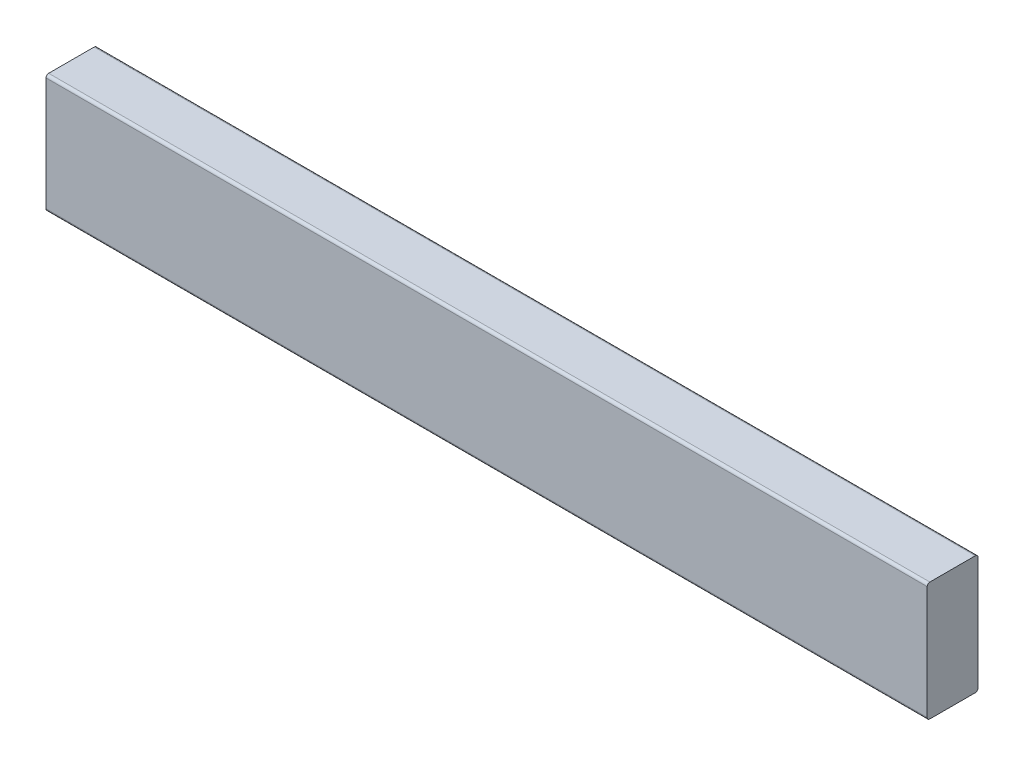
ISO-10303-21;
HEADER;
FILE_DESCRIPTION(('STEP AP214'),'2;1');
FILE_NAME('part.step','',(''),(''),'','','');
FILE_SCHEMA(('AUTOMOTIVE_DESIGN { 1 0 10303 214 1 1 1 1 }'));
ENDSEC;
DATA;
#1=APPLICATION_CONTEXT('core data for automotive mechanical design processes');
#2=APPLICATION_PROTOCOL_DEFINITION('international standard','automotive_design',2000,#1);
#3=PRODUCT_CONTEXT('',#1,'mechanical');
#4=PRODUCT('Part','Part','',(#3));
#5=PRODUCT_RELATED_PRODUCT_CATEGORY('part','',(#4));
#6=PRODUCT_DEFINITION_FORMATION('','',#4);
#7=PRODUCT_DEFINITION_CONTEXT('part definition',#1,'design');
#8=PRODUCT_DEFINITION('design','',#6,#7);
#9=PRODUCT_DEFINITION_SHAPE('','',#8);
#10=(LENGTH_UNIT() NAMED_UNIT(*) SI_UNIT(.MILLI.,.METRE.));
#11=(NAMED_UNIT(*) PLANE_ANGLE_UNIT() SI_UNIT($,.RADIAN.));
#12=(NAMED_UNIT(*) SI_UNIT($,.STERADIAN.) SOLID_ANGLE_UNIT());
#13=UNCERTAINTY_MEASURE_WITH_UNIT(LENGTH_MEASURE(1.E-05),#10,'distance_accuracy_value','');
#14=(GEOMETRIC_REPRESENTATION_CONTEXT(3) GLOBAL_UNCERTAINTY_ASSIGNED_CONTEXT((#13)) GLOBAL_UNIT_ASSIGNED_CONTEXT((#10,
#11,#12)) REPRESENTATION_CONTEXT('',''));
#15=CARTESIAN_POINT('',(0.,0.,0.));
#16=DIRECTION('',(0.,0.,1.));
#17=DIRECTION('',(1.,0.,0.));
#18=AXIS2_PLACEMENT_3D('',#15,#16,#17);
#19=CARTESIAN_POINT('',(660.4,-44.45,19.05));
#20=DIRECTION('',(0.,1.,0.));
#21=DIRECTION('',(0.,0.,1.));
#22=AXIS2_PLACEMENT_3D('',#19,#20,#21);
#23=PLANE('',#22);
#24=DIRECTION('',(0.,0.,-1.));
#25=VECTOR('',#24,1.);
#26=CARTESIAN_POINT('',(0.,-44.45,19.05));
#27=LINE('',#26,#25);
#28=CARTESIAN_POINT('',(0.,-44.45,17.05));
#29=VERTEX_POINT('',#28);
#30=CARTESIAN_POINT('',(0.,-44.45,-17.05));
#31=VERTEX_POINT('',#30);
#32=EDGE_CURVE('E127',#29,#31,#27,.T.);
#33=ORIENTED_EDGE('',*,*,#32,.T.);
#34=DIRECTION('',(-1.,0.,0.));
#35=VECTOR('',#34,1.);
#36=CARTESIAN_POINT('',(660.4,-44.45,-17.05));
#37=LINE('',#36,#35);
#38=CARTESIAN_POINT('',(660.4,-44.45,-17.05));
#39=VERTEX_POINT('',#38);
#40=EDGE_CURVE('E150',#31,#39,#37,.F.);
#41=ORIENTED_EDGE('',*,*,#40,.T.);
#42=DIRECTION('',(0.,0.,-1.));
#43=VECTOR('',#42,1.);
#44=CARTESIAN_POINT('',(660.4,-44.45,19.05));
#45=LINE('',#44,#43);
#46=CARTESIAN_POINT('',(660.4,-44.45,17.05));
#47=VERTEX_POINT('',#46);
#48=EDGE_CURVE('E125',#47,#39,#45,.T.);
#49=ORIENTED_EDGE('',*,*,#48,.F.);
#50=DIRECTION('',(-1.,0.,0.));
#51=VECTOR('',#50,1.);
#52=CARTESIAN_POINT('',(660.4,-44.45,17.05));
#53=LINE('',#52,#51);
#54=EDGE_CURVE('E147',#47,#29,#53,.T.);
#55=ORIENTED_EDGE('',*,*,#54,.T.);
#56=EDGE_LOOP('',(#33,#41,#49,#55));
#57=FACE_BOUND('',#56,.T.);
#58=ADVANCED_FACE('F32',(#57),#23,.F.);
#59=CARTESIAN_POINT('',(660.4,44.45,-19.05));
#60=DIRECTION('',(0.,0.,1.));
#61=DIRECTION('',(1.,0.,0.));
#62=AXIS2_PLACEMENT_3D('',#59,#60,#61);
#63=PLANE('',#62);
#64=DIRECTION('',(0.,1.,0.));
#65=VECTOR('',#64,1.);
#66=CARTESIAN_POINT('',(0.,44.45,-19.05));
#67=LINE('',#66,#65);
#68=CARTESIAN_POINT('',(0.,-42.45,-19.05));
#69=VERTEX_POINT('',#68);
#70=CARTESIAN_POINT('',(0.,42.45,-19.05));
#71=VERTEX_POINT('',#70);
#72=EDGE_CURVE('E123',#69,#71,#67,.T.);
#73=ORIENTED_EDGE('',*,*,#72,.T.);
#74=DIRECTION('',(-1.,0.,0.));
#75=VECTOR('',#74,1.);
#76=CARTESIAN_POINT('',(660.4,42.45,-19.05));
#77=LINE('',#76,#75);
#78=CARTESIAN_POINT('',(660.4,42.45,-19.05));
#79=VERTEX_POINT('',#78);
#80=EDGE_CURVE('E102',#71,#79,#77,.F.);
#81=ORIENTED_EDGE('',*,*,#80,.T.);
#82=DIRECTION('',(0.,1.,0.));
#83=VECTOR('',#82,1.);
#84=CARTESIAN_POINT('',(660.4,44.45,-19.05));
#85=LINE('',#84,#83);
#86=CARTESIAN_POINT('',(660.4,-42.45,-19.05));
#87=VERTEX_POINT('',#86);
#88=EDGE_CURVE('E166',#87,#79,#85,.T.);
#89=ORIENTED_EDGE('',*,*,#88,.F.);
#90=DIRECTION('',(-1.,0.,0.));
#91=VECTOR('',#90,1.);
#92=CARTESIAN_POINT('',(660.4,-42.45,-19.05));
#93=LINE('',#92,#91);
#94=EDGE_CURVE('E107',#87,#69,#93,.T.);
#95=ORIENTED_EDGE('',*,*,#94,.T.);
#96=EDGE_LOOP('',(#73,#81,#89,#95));
#97=FACE_BOUND('',#96,.T.);
#98=ADVANCED_FACE('F183',(#97),#63,.F.);
#99=CARTESIAN_POINT('',(660.4,44.45,19.05));
#100=DIRECTION('',(0.,-1.,0.));
#101=DIRECTION('',(0.,0.,-1.));
#102=AXIS2_PLACEMENT_3D('',#99,#100,#101);
#103=PLANE('',#102);
#104=DIRECTION('',(0.,0.,1.));
#105=VECTOR('',#104,1.);
#106=CARTESIAN_POINT('',(660.4,44.45,19.05));
#107=LINE('',#106,#105);
#108=CARTESIAN_POINT('',(660.4,44.45,-17.05));
#109=VERTEX_POINT('',#108);
#110=CARTESIAN_POINT('',(660.4,44.45,17.05));
#111=VERTEX_POINT('',#110);
#112=EDGE_CURVE('E116',#109,#111,#107,.T.);
#113=ORIENTED_EDGE('',*,*,#112,.F.);
#114=DIRECTION('',(-1.,0.,0.));
#115=VECTOR('',#114,1.);
#116=CARTESIAN_POINT('',(660.4,44.45,-17.05));
#117=LINE('',#116,#115);
#118=CARTESIAN_POINT('',(0.,44.45,-17.05));
#119=VERTEX_POINT('',#118);
#120=EDGE_CURVE('E101',#109,#119,#117,.T.);
#121=ORIENTED_EDGE('',*,*,#120,.T.);
#122=DIRECTION('',(0.,0.,1.));
#123=VECTOR('',#122,1.);
#124=CARTESIAN_POINT('',(0.,44.45,19.05));
#125=LINE('',#124,#123);
#126=CARTESIAN_POINT('',(0.,44.45,17.05));
#127=VERTEX_POINT('',#126);
#128=EDGE_CURVE('E114',#119,#127,#125,.T.);
#129=ORIENTED_EDGE('',*,*,#128,.T.);
#130=DIRECTION('',(-1.,0.,0.));
#131=VECTOR('',#130,1.);
#132=CARTESIAN_POINT('',(660.4,44.45,17.05));
#133=LINE('',#132,#131);
#134=EDGE_CURVE('E118',#127,#111,#133,.F.);
#135=ORIENTED_EDGE('',*,*,#134,.T.);
#136=EDGE_LOOP('',(#113,#121,#129,#135));
#137=FACE_BOUND('',#136,.T.);
#138=ADVANCED_FACE('F113',(#137),#103,.F.);
#139=CARTESIAN_POINT('',(660.4,44.45,19.05));
#140=DIRECTION('',(0.,0.,-1.));
#141=DIRECTION('',(-1.,0.,0.));
#142=AXIS2_PLACEMENT_3D('',#139,#140,#141);
#143=PLANE('',#142);
#144=DIRECTION('',(0.,-1.,0.));
#145=VECTOR('',#144,1.);
#146=CARTESIAN_POINT('',(0.,44.45,19.05));
#147=LINE('',#146,#145);
#148=CARTESIAN_POINT('',(0.,42.45,19.05));
#149=VERTEX_POINT('',#148);
#150=CARTESIAN_POINT('',(0.,-42.45,19.05));
#151=VERTEX_POINT('',#150);
#152=EDGE_CURVE('E122',#149,#151,#147,.T.);
#153=ORIENTED_EDGE('',*,*,#152,.T.);
#154=DIRECTION('',(-1.,0.,0.));
#155=VECTOR('',#154,1.);
#156=CARTESIAN_POINT('',(660.4,-42.45,19.05));
#157=LINE('',#156,#155);
#158=CARTESIAN_POINT('',(660.4,-42.45,19.05));
#159=VERTEX_POINT('',#158);
#160=EDGE_CURVE('E11',#151,#159,#157,.F.);
#161=ORIENTED_EDGE('',*,*,#160,.T.);
#162=DIRECTION('',(0.,-1.,0.));
#163=VECTOR('',#162,1.);
#164=CARTESIAN_POINT('',(660.4,44.45,19.05));
#165=LINE('',#164,#163);
#166=CARTESIAN_POINT('',(660.4,42.45,19.05));
#167=VERTEX_POINT('',#166);
#168=EDGE_CURVE('E131',#167,#159,#165,.T.);
#169=ORIENTED_EDGE('',*,*,#168,.F.);
#170=DIRECTION('',(-1.,0.,0.));
#171=VECTOR('',#170,1.);
#172=CARTESIAN_POINT('',(660.4,42.45,19.05));
#173=LINE('',#172,#171);
#174=EDGE_CURVE('E40',#167,#149,#173,.T.);
#175=ORIENTED_EDGE('',*,*,#174,.T.);
#176=EDGE_LOOP('',(#153,#161,#169,#175));
#177=FACE_BOUND('',#176,.T.);
#178=ADVANCED_FACE('F153',(#177),#143,.F.);
#179=CARTESIAN_POINT('',(660.4,0.,0.));
#180=DIRECTION('',(-1.,0.,0.));
#181=DIRECTION('',(0.,0.,1.));
#182=AXIS2_PLACEMENT_3D('',#179,#180,#181);
#183=PLANE('',#182);
#184=ORIENTED_EDGE('',*,*,#88,.T.);
#185=CARTESIAN_POINT('',(660.4,42.45,-17.05));
#186=DIRECTION('',(-1.,0.,0.));
#187=DIRECTION('',(0.,0.,1.));
#188=AXIS2_PLACEMENT_3D('',#185,#186,#187);
#189=CIRCLE('',#188,2.);
#190=EDGE_CURVE('E145',#79,#109,#189,.F.);
#191=ORIENTED_EDGE('',*,*,#190,.T.);
#192=ORIENTED_EDGE('',*,*,#112,.T.);
#193=CARTESIAN_POINT('',(660.4,42.45,17.05));
#194=DIRECTION('',(-1.,0.,0.));
#195=DIRECTION('',(0.,0.,1.));
#196=AXIS2_PLACEMENT_3D('',#193,#194,#195);
#197=CIRCLE('',#196,2.);
#198=EDGE_CURVE('E52',#111,#167,#197,.F.);
#199=ORIENTED_EDGE('',*,*,#198,.T.);
#200=ORIENTED_EDGE('',*,*,#168,.T.);
#201=CARTESIAN_POINT('',(660.4,-42.45,17.05));
#202=DIRECTION('',(-1.,0.,0.));
#203=DIRECTION('',(0.,0.,1.));
#204=AXIS2_PLACEMENT_3D('',#201,#202,#203);
#205=CIRCLE('',#204,2.);
#206=EDGE_CURVE('E141',#159,#47,#205,.F.);
#207=ORIENTED_EDGE('',*,*,#206,.T.);
#208=ORIENTED_EDGE('',*,*,#48,.T.);
#209=CARTESIAN_POINT('',(660.4,-42.45,-17.05));
#210=DIRECTION('',(-1.,0.,0.));
#211=DIRECTION('',(0.,0.,1.));
#212=AXIS2_PLACEMENT_3D('',#209,#210,#211);
#213=CIRCLE('',#212,2.);
#214=EDGE_CURVE('E143',#39,#87,#213,.F.);
#215=ORIENTED_EDGE('',*,*,#214,.T.);
#216=EDGE_LOOP('',(#184,#191,#192,#199,#200,#207,#208,#215));
#217=FACE_BOUND('',#216,.T.);
#218=ADVANCED_FACE('F172',(#217),#183,.F.);
#219=CARTESIAN_POINT('',(0.,0.,0.));
#220=DIRECTION('',(-1.,0.,0.));
#221=DIRECTION('',(0.,0.,1.));
#222=AXIS2_PLACEMENT_3D('',#219,#220,#221);
#223=PLANE('',#222);
#224=ORIENTED_EDGE('',*,*,#128,.F.);
#225=CARTESIAN_POINT('',(0.,42.45,-17.05));
#226=DIRECTION('',(-1.,0.,0.));
#227=DIRECTION('',(0.,0.,1.));
#228=AXIS2_PLACEMENT_3D('',#225,#226,#227);
#229=CIRCLE('',#228,2.);
#230=EDGE_CURVE('E97',#119,#71,#229,.T.);
#231=ORIENTED_EDGE('',*,*,#230,.T.);
#232=ORIENTED_EDGE('',*,*,#72,.F.);
#233=CARTESIAN_POINT('',(0.,-42.45,-17.05));
#234=DIRECTION('',(-1.,0.,0.));
#235=DIRECTION('',(0.,0.,1.));
#236=AXIS2_PLACEMENT_3D('',#233,#234,#235);
#237=CIRCLE('',#236,2.);
#238=EDGE_CURVE('E108',#69,#31,#237,.T.);
#239=ORIENTED_EDGE('',*,*,#238,.T.);
#240=ORIENTED_EDGE('',*,*,#32,.F.);
#241=CARTESIAN_POINT('',(0.,-42.45,17.05));
#242=DIRECTION('',(-1.,0.,0.));
#243=DIRECTION('',(0.,0.,1.));
#244=AXIS2_PLACEMENT_3D('',#241,#242,#243);
#245=CIRCLE('',#244,2.);
#246=EDGE_CURVE('E134',#29,#151,#245,.T.);
#247=ORIENTED_EDGE('',*,*,#246,.T.);
#248=ORIENTED_EDGE('',*,*,#152,.F.);
#249=CARTESIAN_POINT('',(0.,42.45,17.05));
#250=DIRECTION('',(-1.,0.,0.));
#251=DIRECTION('',(0.,0.,1.));
#252=AXIS2_PLACEMENT_3D('',#249,#250,#251);
#253=CIRCLE('',#252,2.);
#254=EDGE_CURVE('E117',#149,#127,#253,.T.);
#255=ORIENTED_EDGE('',*,*,#254,.T.);
#256=EDGE_LOOP('',(#224,#231,#232,#239,#240,#247,#248,#255));
#257=FACE_BOUND('',#256,.T.);
#258=ADVANCED_FACE('F120',(#257),#223,.T.);
#259=CARTESIAN_POINT('',(660.4,42.45,-17.05));
#260=DIRECTION('',(-1.,0.,0.));
#261=DIRECTION('',(0.,0.,1.));
#262=AXIS2_PLACEMENT_3D('',#259,#260,#261);
#263=CYLINDRICAL_SURFACE('',#262,2.);
#264=ORIENTED_EDGE('',*,*,#190,.F.);
#265=ORIENTED_EDGE('',*,*,#80,.F.);
#266=ORIENTED_EDGE('',*,*,#230,.F.);
#267=ORIENTED_EDGE('',*,*,#120,.F.);
#268=EDGE_LOOP('',(#264,#265,#266,#267));
#269=FACE_BOUND('',#268,.T.);
#270=ADVANCED_FACE('F100',(#269),#263,.T.);
#271=CARTESIAN_POINT('',(660.4,-42.45,-17.05));
#272=DIRECTION('',(-1.,0.,0.));
#273=DIRECTION('',(0.,0.,1.));
#274=AXIS2_PLACEMENT_3D('',#271,#272,#273);
#275=CYLINDRICAL_SURFACE('',#274,2.);
#276=ORIENTED_EDGE('',*,*,#214,.F.);
#277=ORIENTED_EDGE('',*,*,#40,.F.);
#278=ORIENTED_EDGE('',*,*,#238,.F.);
#279=ORIENTED_EDGE('',*,*,#94,.F.);
#280=EDGE_LOOP('',(#276,#277,#278,#279));
#281=FACE_BOUND('',#280,.T.);
#282=ADVANCED_FACE('F194',(#281),#275,.T.);
#283=CARTESIAN_POINT('',(660.4,-42.45,17.05));
#284=DIRECTION('',(-1.,0.,0.));
#285=DIRECTION('',(0.,0.,1.));
#286=AXIS2_PLACEMENT_3D('',#283,#284,#285);
#287=CYLINDRICAL_SURFACE('',#286,2.);
#288=ORIENTED_EDGE('',*,*,#206,.F.);
#289=ORIENTED_EDGE('',*,*,#160,.F.);
#290=ORIENTED_EDGE('',*,*,#246,.F.);
#291=ORIENTED_EDGE('',*,*,#54,.F.);
#292=EDGE_LOOP('',(#288,#289,#290,#291));
#293=FACE_BOUND('',#292,.T.);
#294=ADVANCED_FACE('F160',(#293),#287,.T.);
#295=CARTESIAN_POINT('',(660.4,42.45,17.05));
#296=DIRECTION('',(-1.,0.,0.));
#297=DIRECTION('',(0.,0.,1.));
#298=AXIS2_PLACEMENT_3D('',#295,#296,#297);
#299=CYLINDRICAL_SURFACE('',#298,2.);
#300=ORIENTED_EDGE('',*,*,#198,.F.);
#301=ORIENTED_EDGE('',*,*,#134,.F.);
#302=ORIENTED_EDGE('',*,*,#254,.F.);
#303=ORIENTED_EDGE('',*,*,#174,.F.);
#304=EDGE_LOOP('',(#300,#301,#302,#303));
#305=FACE_BOUND('',#304,.T.);
#306=ADVANCED_FACE('F34',(#305),#299,.T.);
#307=CLOSED_SHELL('',(#58,#98,#138,#178,#218,#258,#270,#282,#294,#306));
#308=MANIFOLD_SOLID_BREP('B2',#307);
#309=ADVANCED_BREP_SHAPE_REPRESENTATION('',(#18,#308),#14);
#310=SHAPE_DEFINITION_REPRESENTATION(#9,#309);
ENDSEC;
END-ISO-10303-21;
